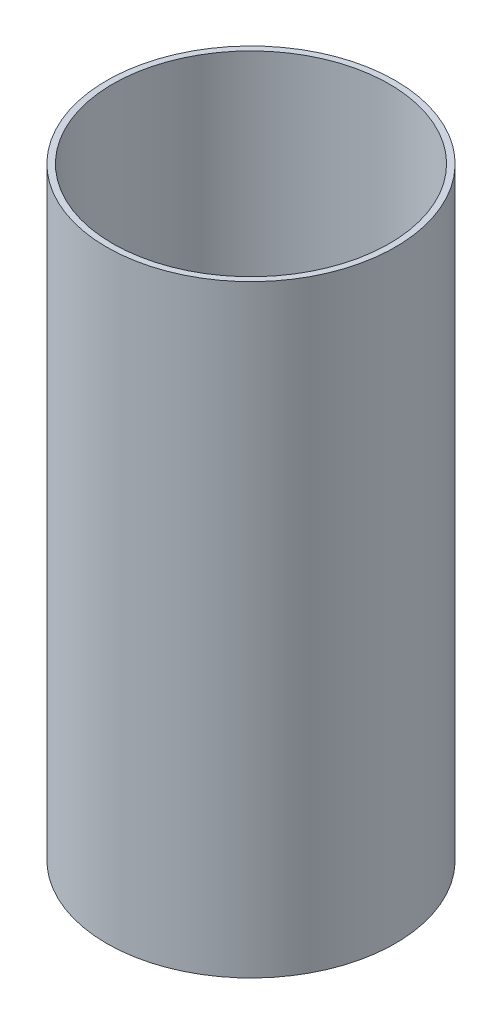
ISO-10303-21;
HEADER;
FILE_DESCRIPTION(('STEP AP214'),'2;1');
FILE_NAME('part.step','',(''),(''),'','','');
FILE_SCHEMA(('AUTOMOTIVE_DESIGN { 1 0 10303 214 1 1 1 1 }'));
ENDSEC;
DATA;
#1=APPLICATION_CONTEXT('core data for automotive mechanical design processes');
#2=APPLICATION_PROTOCOL_DEFINITION('international standard','automotive_design',2000,#1);
#3=PRODUCT_CONTEXT('',#1,'mechanical');
#4=PRODUCT('Part','Part','',(#3));
#5=PRODUCT_RELATED_PRODUCT_CATEGORY('part','',(#4));
#6=PRODUCT_DEFINITION_FORMATION('','',#4);
#7=PRODUCT_DEFINITION_CONTEXT('part definition',#1,'design');
#8=PRODUCT_DEFINITION('design','',#6,#7);
#9=PRODUCT_DEFINITION_SHAPE('','',#8);
#10=(LENGTH_UNIT() NAMED_UNIT(*) SI_UNIT(.MILLI.,.METRE.));
#11=(NAMED_UNIT(*) PLANE_ANGLE_UNIT() SI_UNIT($,.RADIAN.));
#12=(NAMED_UNIT(*) SI_UNIT($,.STERADIAN.) SOLID_ANGLE_UNIT());
#13=UNCERTAINTY_MEASURE_WITH_UNIT(LENGTH_MEASURE(1.E-05),#10,'distance_accuracy_value','');
#14=(GEOMETRIC_REPRESENTATION_CONTEXT(3) GLOBAL_UNCERTAINTY_ASSIGNED_CONTEXT((#13)) GLOBAL_UNIT_ASSIGNED_CONTEXT((#10,
#11,#12)) REPRESENTATION_CONTEXT('',''));
#15=CARTESIAN_POINT('',(0.,0.,0.));
#16=DIRECTION('',(0.,0.,1.));
#17=DIRECTION('',(1.,0.,0.));
#18=AXIS2_PLACEMENT_3D('',#15,#16,#17);
#19=CARTESIAN_POINT('',(-16.5477394319178,150.,0.));
#20=DIRECTION('',(0.,1.,0.));
#21=DIRECTION('',(0.,0.,1.));
#22=AXIS2_PLACEMENT_3D('',#19,#20,#21);
#23=PLANE('',#22);
#24=CARTESIAN_POINT('',(-16.5477394319178,150.,0.));
#25=DIRECTION('',(0.,1.,0.));
#26=DIRECTION('',(0.,0.,1.));
#27=AXIS2_PLACEMENT_3D('',#24,#25,#26);
#28=CIRCLE('',#27,35.9);
#29=CARTESIAN_POINT('',(-16.5477394319178,150.,35.9));
#30=VERTEX_POINT('',#29);
#31=EDGE_CURVE('E10',#30,#30,#28,.T.);
#32=ORIENTED_EDGE('',*,*,#31,.T.);
#33=EDGE_LOOP('',(#32));
#34=FACE_BOUND('',#33,.T.);
#35=CARTESIAN_POINT('',(-16.5477394319178,150.,0.));
#36=DIRECTION('',(0.,1.,0.));
#37=DIRECTION('',(0.,0.,1.));
#38=AXIS2_PLACEMENT_3D('',#35,#36,#37);
#39=CIRCLE('',#38,34.4);
#40=CARTESIAN_POINT('',(-16.5477394319178,150.,34.4));
#41=VERTEX_POINT('',#40);
#42=EDGE_CURVE('E56',#41,#41,#39,.T.);
#43=ORIENTED_EDGE('',*,*,#42,.F.);
#44=EDGE_LOOP('',(#43));
#45=FACE_BOUND('',#44,.T.);
#46=ADVANCED_FACE('F43',(#34,#45),#23,.T.);
#47=CARTESIAN_POINT('',(-16.5477394319178,0.,0.));
#48=DIRECTION('',(0.,1.,0.));
#49=DIRECTION('',(0.,0.,1.));
#50=AXIS2_PLACEMENT_3D('',#47,#48,#49);
#51=PLANE('',#50);
#52=CARTESIAN_POINT('',(-16.5477394319178,0.,0.));
#53=DIRECTION('',(0.,1.,0.));
#54=DIRECTION('',(0.,0.,1.));
#55=AXIS2_PLACEMENT_3D('',#52,#53,#54);
#56=CIRCLE('',#55,35.9);
#57=CARTESIAN_POINT('',(-16.5477394319178,0.,35.9));
#58=VERTEX_POINT('',#57);
#59=EDGE_CURVE('E47',#58,#58,#56,.T.);
#60=ORIENTED_EDGE('',*,*,#59,.F.);
#61=EDGE_LOOP('',(#60));
#62=FACE_BOUND('',#61,.T.);
#63=CARTESIAN_POINT('',(-16.5477394319178,0.,0.));
#64=DIRECTION('',(0.,1.,0.));
#65=DIRECTION('',(0.,0.,1.));
#66=AXIS2_PLACEMENT_3D('',#63,#64,#65);
#67=CIRCLE('',#66,34.4);
#68=CARTESIAN_POINT('',(-16.5477394319178,0.,34.4));
#69=VERTEX_POINT('',#68);
#70=EDGE_CURVE('E58',#69,#69,#67,.T.);
#71=ORIENTED_EDGE('',*,*,#70,.T.);
#72=EDGE_LOOP('',(#71));
#73=FACE_BOUND('',#72,.T.);
#74=ADVANCED_FACE('F70',(#62,#73),#51,.F.);
#75=CARTESIAN_POINT('',(-16.5477394319178,150.,0.));
#76=DIRECTION('',(0.,-1.,0.));
#77=DIRECTION('',(0.,0.,-1.));
#78=AXIS2_PLACEMENT_3D('',#75,#76,#77);
#79=CYLINDRICAL_SURFACE('',#78,35.9);
#80=ORIENTED_EDGE('',*,*,#31,.F.);
#81=EDGE_LOOP('',(#80));
#82=FACE_BOUND('',#81,.T.);
#83=ORIENTED_EDGE('',*,*,#59,.T.);
#84=EDGE_LOOP('',(#83));
#85=FACE_BOUND('',#84,.T.);
#86=ADVANCED_FACE('F45',(#82,#85),#79,.T.);
#87=CARTESIAN_POINT('',(-16.5477394319178,150.,0.));
#88=DIRECTION('',(0.,-1.,0.));
#89=DIRECTION('',(0.,0.,-1.));
#90=AXIS2_PLACEMENT_3D('',#87,#88,#89);
#91=CYLINDRICAL_SURFACE('',#90,34.4);
#92=ORIENTED_EDGE('',*,*,#42,.T.);
#93=EDGE_LOOP('',(#92));
#94=FACE_BOUND('',#93,.T.);
#95=ORIENTED_EDGE('',*,*,#70,.F.);
#96=EDGE_LOOP('',(#95));
#97=FACE_BOUND('',#96,.T.);
#98=ADVANCED_FACE('F66',(#94,#97),#91,.F.);
#99=CLOSED_SHELL('',(#46,#74,#86,#98));
#100=MANIFOLD_SOLID_BREP('B2',#99);
#101=ADVANCED_BREP_SHAPE_REPRESENTATION('',(#18,#100),#14);
#102=SHAPE_DEFINITION_REPRESENTATION(#9,#101);
ENDSEC;
END-ISO-10303-21;
